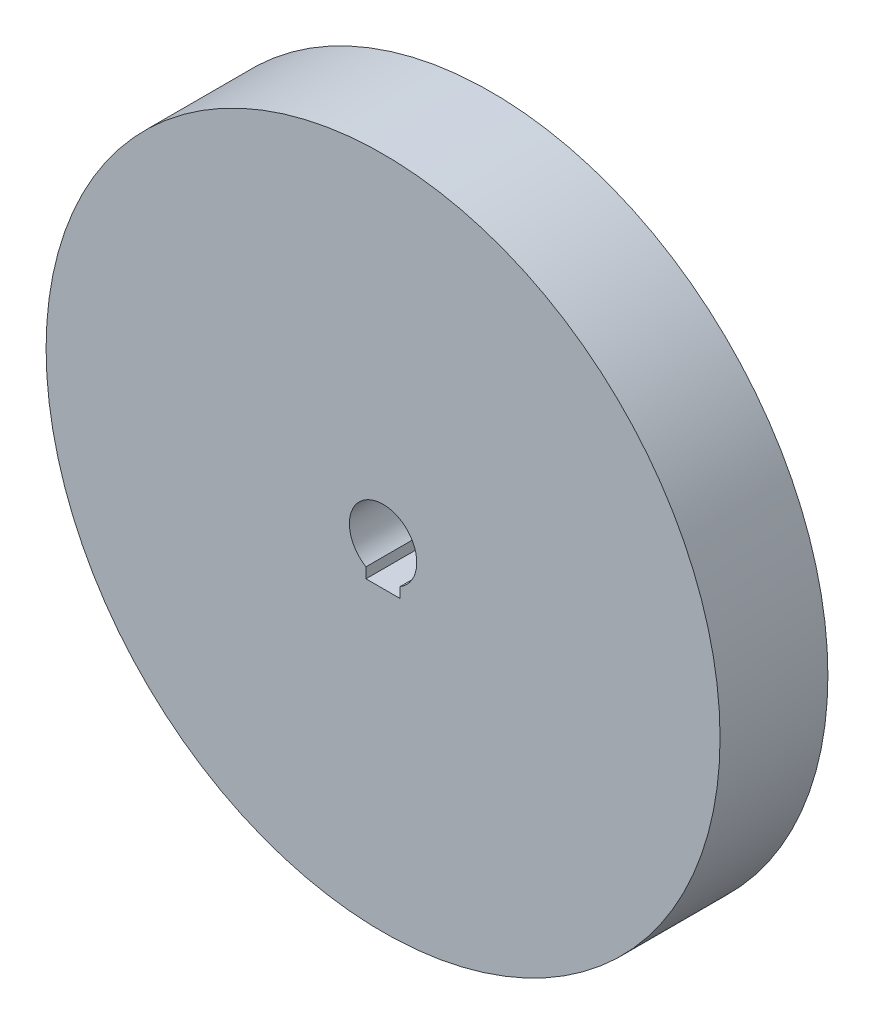
ISO-10303-21;
HEADER;
FILE_DESCRIPTION(('STEP AP214'),'2;1');
FILE_NAME('part.step','',(''),(''),'','','');
FILE_SCHEMA(('AUTOMOTIVE_DESIGN { 1 0 10303 214 1 1 1 1 }'));
ENDSEC;
DATA;
#1=APPLICATION_CONTEXT('core data for automotive mechanical design processes');
#2=APPLICATION_PROTOCOL_DEFINITION('international standard','automotive_design',2000,#1);
#3=PRODUCT_CONTEXT('',#1,'mechanical');
#4=PRODUCT('Part','Part','',(#3));
#5=PRODUCT_RELATED_PRODUCT_CATEGORY('part','',(#4));
#6=PRODUCT_DEFINITION_FORMATION('','',#4);
#7=PRODUCT_DEFINITION_CONTEXT('part definition',#1,'design');
#8=PRODUCT_DEFINITION('design','',#6,#7);
#9=PRODUCT_DEFINITION_SHAPE('','',#8);
#10=(LENGTH_UNIT() NAMED_UNIT(*) SI_UNIT(.MILLI.,.METRE.));
#11=(NAMED_UNIT(*) PLANE_ANGLE_UNIT() SI_UNIT($,.RADIAN.));
#12=(NAMED_UNIT(*) SI_UNIT($,.STERADIAN.) SOLID_ANGLE_UNIT());
#13=UNCERTAINTY_MEASURE_WITH_UNIT(LENGTH_MEASURE(1.E-05),#10,'distance_accuracy_value','');
#14=(GEOMETRIC_REPRESENTATION_CONTEXT(3) GLOBAL_UNCERTAINTY_ASSIGNED_CONTEXT((#13)) GLOBAL_UNIT_ASSIGNED_CONTEXT((#10,
#11,#12)) REPRESENTATION_CONTEXT('',''));
#15=CARTESIAN_POINT('',(0.,0.,0.));
#16=DIRECTION('',(0.,0.,1.));
#17=DIRECTION('',(1.,0.,0.));
#18=AXIS2_PLACEMENT_3D('',#15,#16,#17);
#19=CARTESIAN_POINT('',(0.,0.,40.));
#20=DIRECTION('',(0.,0.,1.));
#21=DIRECTION('',(1.,0.,0.));
#22=AXIS2_PLACEMENT_3D('',#19,#20,#21);
#23=PLANE('',#22);
#24=DIRECTION('',(0.,1.,0.));
#25=VECTOR('',#24,1.);
#26=CARTESIAN_POINT('',(6.34102160664341,-14.6346110474294,40.));
#27=LINE('',#26,#25);
#28=CARTESIAN_POINT('',(6.34102160664341,-14.6346110474294,40.));
#29=VERTEX_POINT('',#28);
#30=CARTESIAN_POINT('',(6.34102160664341,-10.7722534775265,40.));
#31=VERTEX_POINT('',#30);
#32=EDGE_CURVE('E87',#29,#31,#27,.T.);
#33=ORIENTED_EDGE('',*,*,#32,.F.);
#34=DIRECTION('',(1.,0.,0.));
#35=VECTOR('',#34,1.);
#36=CARTESIAN_POINT('',(-6.3410216066434,-14.6346110474294,40.));
#37=LINE('',#36,#35);
#38=CARTESIAN_POINT('',(-6.3410216066434,-14.6346110474294,40.));
#39=VERTEX_POINT('',#38);
#40=EDGE_CURVE('E122',#39,#29,#37,.T.);
#41=ORIENTED_EDGE('',*,*,#40,.F.);
#42=DIRECTION('',(0.,-1.,0.));
#43=VECTOR('',#42,1.);
#44=CARTESIAN_POINT('',(-6.3410216066434,-14.6346110474294,40.));
#45=LINE('',#44,#43);
#46=CARTESIAN_POINT('',(-6.3410216066434,-10.7722534775265,40.));
#47=VERTEX_POINT('',#46);
#48=EDGE_CURVE('E99',#47,#39,#45,.T.);
#49=ORIENTED_EDGE('',*,*,#48,.F.);
#50=CARTESIAN_POINT('',(0.,0.,40.));
#51=DIRECTION('',(0.,0.,1.));
#52=DIRECTION('',(1.,0.,0.));
#53=AXIS2_PLACEMENT_3D('',#50,#51,#52);
#54=CIRCLE('',#53,12.5);
#55=EDGE_CURVE('E105',#31,#47,#54,.T.);
#56=ORIENTED_EDGE('',*,*,#55,.F.);
#57=EDGE_LOOP('',(#33,#41,#49,#56));
#58=FACE_BOUND('',#57,.T.);
#59=CARTESIAN_POINT('',(0.,0.,40.));
#60=DIRECTION('',(0.,0.,1.));
#61=DIRECTION('',(1.,0.,0.));
#62=AXIS2_PLACEMENT_3D('',#59,#60,#61);
#63=CIRCLE('',#62,125.);
#64=CARTESIAN_POINT('',(125.,0.,40.));
#65=VERTEX_POINT('',#64);
#66=EDGE_CURVE('E11',#65,#65,#63,.T.);
#67=ORIENTED_EDGE('',*,*,#66,.T.);
#68=EDGE_LOOP('',(#67));
#69=FACE_BOUND('',#68,.T.);
#70=ADVANCED_FACE('F45',(#58,#69),#23,.T.);
#71=CARTESIAN_POINT('',(0.,0.,0.));
#72=DIRECTION('',(0.,0.,1.));
#73=DIRECTION('',(1.,0.,0.));
#74=AXIS2_PLACEMENT_3D('',#71,#72,#73);
#75=PLANE('',#74);
#76=CARTESIAN_POINT('',(0.,0.,0.));
#77=DIRECTION('',(0.,0.,1.));
#78=DIRECTION('',(1.,0.,0.));
#79=AXIS2_PLACEMENT_3D('',#76,#77,#78);
#80=CIRCLE('',#79,125.);
#81=CARTESIAN_POINT('',(125.,0.,0.));
#82=VERTEX_POINT('',#81);
#83=EDGE_CURVE('E49',#82,#82,#80,.T.);
#84=ORIENTED_EDGE('',*,*,#83,.F.);
#85=EDGE_LOOP('',(#84));
#86=FACE_BOUND('',#85,.T.);
#87=DIRECTION('',(-1.,0.,0.));
#88=VECTOR('',#87,1.);
#89=CARTESIAN_POINT('',(-6.3410216066434,-14.6346110474294,0.));
#90=LINE('',#89,#88);
#91=CARTESIAN_POINT('',(6.34102160664341,-14.6346110474294,0.));
#92=VERTEX_POINT('',#91);
#93=CARTESIAN_POINT('',(-6.3410216066434,-14.6346110474294,0.));
#94=VERTEX_POINT('',#93);
#95=EDGE_CURVE('E127',#92,#94,#90,.T.);
#96=ORIENTED_EDGE('',*,*,#95,.F.);
#97=DIRECTION('',(0.,-1.,0.));
#98=VECTOR('',#97,1.);
#99=CARTESIAN_POINT('',(6.34102160664341,-14.6346110474294,0.));
#100=LINE('',#99,#98);
#101=CARTESIAN_POINT('',(6.34102160664341,-10.7722534775265,0.));
#102=VERTEX_POINT('',#101);
#103=EDGE_CURVE('E109',#102,#92,#100,.T.);
#104=ORIENTED_EDGE('',*,*,#103,.F.);
#105=CARTESIAN_POINT('',(0.,0.,0.));
#106=DIRECTION('',(0.,0.,1.));
#107=DIRECTION('',(1.,0.,0.));
#108=AXIS2_PLACEMENT_3D('',#105,#106,#107);
#109=CIRCLE('',#108,12.5);
#110=CARTESIAN_POINT('',(-6.3410216066434,-10.7722534775265,0.));
#111=VERTEX_POINT('',#110);
#112=EDGE_CURVE('E98',#102,#111,#109,.T.);
#113=ORIENTED_EDGE('',*,*,#112,.T.);
#114=DIRECTION('',(0.,1.,0.));
#115=VECTOR('',#114,1.);
#116=CARTESIAN_POINT('',(-6.3410216066434,-14.6346110474294,0.));
#117=LINE('',#116,#115);
#118=EDGE_CURVE('E61',#94,#111,#117,.T.);
#119=ORIENTED_EDGE('',*,*,#118,.F.);
#120=EDGE_LOOP('',(#96,#104,#113,#119));
#121=FACE_BOUND('',#120,.T.);
#122=ADVANCED_FACE('F140',(#86,#121),#75,.F.);
#123=CARTESIAN_POINT('',(0.,0.,40.));
#124=DIRECTION('',(0.,0.,-1.));
#125=DIRECTION('',(-1.,0.,0.));
#126=AXIS2_PLACEMENT_3D('',#123,#124,#125);
#127=CYLINDRICAL_SURFACE('',#126,125.);
#128=ORIENTED_EDGE('',*,*,#66,.F.);
#129=EDGE_LOOP('',(#128));
#130=FACE_BOUND('',#129,.T.);
#131=ORIENTED_EDGE('',*,*,#83,.T.);
#132=EDGE_LOOP('',(#131));
#133=FACE_BOUND('',#132,.T.);
#134=ADVANCED_FACE('F47',(#130,#133),#127,.T.);
#135=CARTESIAN_POINT('',(0.,0.,40.));
#136=DIRECTION('',(0.,0.,-1.));
#137=DIRECTION('',(-1.,0.,0.));
#138=AXIS2_PLACEMENT_3D('',#135,#136,#137);
#139=CYLINDRICAL_SURFACE('',#138,12.5);
#140=DIRECTION('',(0.,0.,-1.));
#141=VECTOR('',#140,1.);
#142=CARTESIAN_POINT('',(6.34102160664341,-10.7722534775265,40.));
#143=LINE('',#142,#141);
#144=EDGE_CURVE('E91',#102,#31,#143,.F.);
#145=ORIENTED_EDGE('',*,*,#144,.T.);
#146=ORIENTED_EDGE('',*,*,#55,.T.);
#147=DIRECTION('',(0.,0.,-1.));
#148=VECTOR('',#147,1.);
#149=CARTESIAN_POINT('',(-6.3410216066434,-10.7722534775265,40.));
#150=LINE('',#149,#148);
#151=EDGE_CURVE('E108',#47,#111,#150,.T.);
#152=ORIENTED_EDGE('',*,*,#151,.T.);
#153=ORIENTED_EDGE('',*,*,#112,.F.);
#154=EDGE_LOOP('',(#145,#146,#152,#153));
#155=FACE_BOUND('',#154,.T.);
#156=ADVANCED_FACE('F104',(#155),#139,.F.);
#157=CARTESIAN_POINT('',(6.34102160664341,-14.6346110474294,-0.002000000000002));
#158=DIRECTION('',(1.,0.,0.));
#159=DIRECTION('',(0.,1.,0.));
#160=AXIS2_PLACEMENT_3D('',#157,#158,#159);
#161=PLANE('',#160);
#162=ORIENTED_EDGE('',*,*,#103,.T.);
#163=DIRECTION('',(0.,0.,1.));
#164=VECTOR('',#163,1.);
#165=CARTESIAN_POINT('',(6.34102160664341,-14.6346110474294,-0.002000000000002));
#166=LINE('',#165,#164);
#167=EDGE_CURVE('E93',#92,#29,#166,.T.);
#168=ORIENTED_EDGE('',*,*,#167,.T.);
#169=ORIENTED_EDGE('',*,*,#32,.T.);
#170=ORIENTED_EDGE('',*,*,#144,.F.);
#171=EDGE_LOOP('',(#162,#168,#169,#170));
#172=FACE_BOUND('',#171,.T.);
#173=ADVANCED_FACE('F90',(#172),#161,.F.);
#174=CARTESIAN_POINT('',(-6.3410216066434,-14.6346110474294,-0.002000000000002));
#175=DIRECTION('',(-1.,0.,0.));
#176=DIRECTION('',(0.,-1.,0.));
#177=AXIS2_PLACEMENT_3D('',#174,#175,#176);
#178=PLANE('',#177);
#179=ORIENTED_EDGE('',*,*,#48,.T.);
#180=DIRECTION('',(0.,0.,1.));
#181=VECTOR('',#180,1.);
#182=CARTESIAN_POINT('',(-6.3410216066434,-14.6346110474294,-0.002000000000002));
#183=LINE('',#182,#181);
#184=EDGE_CURVE('E68',#94,#39,#183,.T.);
#185=ORIENTED_EDGE('',*,*,#184,.F.);
#186=ORIENTED_EDGE('',*,*,#118,.T.);
#187=ORIENTED_EDGE('',*,*,#151,.F.);
#188=EDGE_LOOP('',(#179,#185,#186,#187));
#189=FACE_BOUND('',#188,.T.);
#190=ADVANCED_FACE('F155',(#189),#178,.F.);
#191=CARTESIAN_POINT('',(-6.3410216066434,-14.6346110474294,-0.002000000000002));
#192=DIRECTION('',(0.,-1.,0.));
#193=DIRECTION('',(0.,0.,-1.));
#194=AXIS2_PLACEMENT_3D('',#191,#192,#193);
#195=PLANE('',#194);
#196=ORIENTED_EDGE('',*,*,#95,.T.);
#197=ORIENTED_EDGE('',*,*,#184,.T.);
#198=ORIENTED_EDGE('',*,*,#40,.T.);
#199=ORIENTED_EDGE('',*,*,#167,.F.);
#200=EDGE_LOOP('',(#196,#197,#198,#199));
#201=FACE_BOUND('',#200,.T.);
#202=ADVANCED_FACE('F137',(#201),#195,.F.);
#203=CLOSED_SHELL('',(#70,#122,#134,#156,#173,#190,#202));
#204=MANIFOLD_SOLID_BREP('B2',#203);
#205=ADVANCED_BREP_SHAPE_REPRESENTATION('',(#18,#204),#14);
#206=SHAPE_DEFINITION_REPRESENTATION(#9,#205);
ENDSEC;
END-ISO-10303-21;
